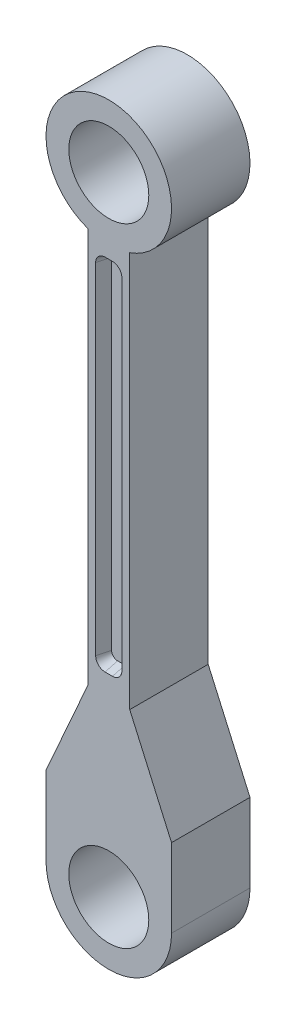
ISO-10303-21;
HEADER;
FILE_DESCRIPTION(('STEP AP214'),'2;1');
FILE_NAME('part.step','',(''),(''),'','','');
FILE_SCHEMA(('AUTOMOTIVE_DESIGN { 1 0 10303 214 1 1 1 1 }'));
ENDSEC;
DATA;
#1=APPLICATION_CONTEXT('core data for automotive mechanical design processes');
#2=APPLICATION_PROTOCOL_DEFINITION('international standard','automotive_design',2000,#1);
#3=PRODUCT_CONTEXT('',#1,'mechanical');
#4=PRODUCT('Part','Part','',(#3));
#5=PRODUCT_RELATED_PRODUCT_CATEGORY('part','',(#4));
#6=PRODUCT_DEFINITION_FORMATION('','',#4);
#7=PRODUCT_DEFINITION_CONTEXT('part definition',#1,'design');
#8=PRODUCT_DEFINITION('design','',#6,#7);
#9=PRODUCT_DEFINITION_SHAPE('','',#8);
#10=(LENGTH_UNIT() NAMED_UNIT(*) SI_UNIT(.MILLI.,.METRE.));
#11=(NAMED_UNIT(*) PLANE_ANGLE_UNIT() SI_UNIT($,.RADIAN.));
#12=(NAMED_UNIT(*) SI_UNIT($,.STERADIAN.) SOLID_ANGLE_UNIT());
#13=UNCERTAINTY_MEASURE_WITH_UNIT(LENGTH_MEASURE(1.E-05),#10,'distance_accuracy_value','');
#14=(GEOMETRIC_REPRESENTATION_CONTEXT(3) GLOBAL_UNCERTAINTY_ASSIGNED_CONTEXT((#13)) GLOBAL_UNIT_ASSIGNED_CONTEXT((#10,
#11,#12)) REPRESENTATION_CONTEXT('',''));
#15=CARTESIAN_POINT('',(0.,0.,0.));
#16=DIRECTION('',(0.,0.,1.));
#17=DIRECTION('',(1.,0.,0.));
#18=AXIS2_PLACEMENT_3D('',#15,#16,#17);
#19=CARTESIAN_POINT('',(0.,11.0248040828004,6.35));
#20=DIRECTION('',(0.,0.,1.));
#21=DIRECTION('',(1.,0.,0.));
#22=AXIS2_PLACEMENT_3D('',#19,#20,#21);
#23=PLANE('',#22);
#24=CARTESIAN_POINT('',(0.,-90.5751959171996,6.35));
#25=DIRECTION('',(0.,0.,1.));
#26=DIRECTION('',(1.,0.,0.));
#27=AXIS2_PLACEMENT_3D('',#24,#25,#26);
#28=CIRCLE('',#27,6.477);
#29=CARTESIAN_POINT('',(6.477,-90.5751959171996,6.35));
#30=VERTEX_POINT('',#29);
#31=EDGE_CURVE('E293',#30,#30,#28,.T.);
#32=ORIENTED_EDGE('',*,*,#31,.F.);
#33=EDGE_LOOP('',(#32));
#34=FACE_BOUND('',#33,.T.);
#35=CARTESIAN_POINT('',(0.,11.0248040828004,6.35));
#36=DIRECTION('',(0.,0.,1.));
#37=DIRECTION('',(1.,0.,0.));
#38=AXIS2_PLACEMENT_3D('',#35,#36,#37);
#39=CIRCLE('',#38,10.16);
#40=CARTESIAN_POINT('',(3.3941513713333,1.44851375363451,6.35));
#41=VERTEX_POINT('',#40);
#42=CARTESIAN_POINT('',(-3.3941513713333,1.44851375363451,6.35));
#43=VERTEX_POINT('',#42);
#44=EDGE_CURVE('E331',#41,#43,#39,.T.);
#45=ORIENTED_EDGE('',*,*,#44,.T.);
#46=DIRECTION('',(0.,-1.,0.));
#47=VECTOR('',#46,1.);
#48=CARTESIAN_POINT('',(-3.3941513713333,-62.607190678735,6.35));
#49=LINE('',#48,#47);
#50=CARTESIAN_POINT('',(-3.3941513713333,-62.607190678735,6.35));
#51=VERTEX_POINT('',#50);
#52=EDGE_CURVE('E334',#43,#51,#49,.T.);
#53=ORIENTED_EDGE('',*,*,#52,.T.);
#54=DIRECTION('',(-0.405141586779867,-0.914253955234262,0.));
#55=VECTOR('',#54,1.);
#56=CARTESIAN_POINT('',(-10.16,-77.8751959171996,6.35));
#57=LINE('',#56,#55);
#58=CARTESIAN_POINT('',(-10.16,-77.8751959171996,6.35));
#59=VERTEX_POINT('',#58);
#60=EDGE_CURVE('E337',#51,#59,#57,.T.);
#61=ORIENTED_EDGE('',*,*,#60,.T.);
#62=DIRECTION('',(0.,-1.,0.));
#63=VECTOR('',#62,1.);
#64=CARTESIAN_POINT('',(-10.16,-90.5751959171996,6.35));
#65=LINE('',#64,#63);
#66=CARTESIAN_POINT('',(-10.16,-90.5751959171996,6.35));
#67=VERTEX_POINT('',#66);
#68=EDGE_CURVE('E340',#59,#67,#65,.T.);
#69=ORIENTED_EDGE('',*,*,#68,.T.);
#70=CARTESIAN_POINT('',(0.,-90.5751959171996,6.35));
#71=DIRECTION('',(0.,0.,1.));
#72=DIRECTION('',(1.,0.,0.));
#73=AXIS2_PLACEMENT_3D('',#70,#71,#72);
#74=CIRCLE('',#73,10.16);
#75=CARTESIAN_POINT('',(10.16,-90.5751959171996,6.35));
#76=VERTEX_POINT('',#75);
#77=EDGE_CURVE('E343',#67,#76,#74,.T.);
#78=ORIENTED_EDGE('',*,*,#77,.T.);
#79=DIRECTION('',(0.,1.,0.));
#80=VECTOR('',#79,1.);
#81=CARTESIAN_POINT('',(10.16,-90.5751959171996,6.35));
#82=LINE('',#81,#80);
#83=CARTESIAN_POINT('',(10.16,-77.8751959171996,6.35));
#84=VERTEX_POINT('',#83);
#85=EDGE_CURVE('E346',#76,#84,#82,.T.);
#86=ORIENTED_EDGE('',*,*,#85,.T.);
#87=DIRECTION('',(-0.405141586779867,0.914253955234262,0.));
#88=VECTOR('',#87,1.);
#89=CARTESIAN_POINT('',(10.16,-77.8751959171996,6.35));
#90=LINE('',#89,#88);
#91=CARTESIAN_POINT('',(3.3941513713333,-62.607190678735,6.35));
#92=VERTEX_POINT('',#91);
#93=EDGE_CURVE('E349',#84,#92,#90,.T.);
#94=ORIENTED_EDGE('',*,*,#93,.T.);
#95=DIRECTION('',(0.,1.,0.));
#96=VECTOR('',#95,1.);
#97=CARTESIAN_POINT('',(3.3941513713333,-62.607190678735,6.35));
#98=LINE('',#97,#96);
#99=EDGE_CURVE('E352',#92,#41,#98,.T.);
#100=ORIENTED_EDGE('',*,*,#99,.T.);
#101=EDGE_LOOP('',(#45,#53,#61,#69,#78,#86,#94,#100));
#102=FACE_BOUND('',#101,.T.);
#103=CARTESIAN_POINT('',(0.,11.0248040828004,6.35));
#104=DIRECTION('',(0.,0.,1.));
#105=DIRECTION('',(1.,0.,0.));
#106=AXIS2_PLACEMENT_3D('',#103,#104,#105);
#107=CIRCLE('',#106,6.477);
#108=CARTESIAN_POINT('',(6.477,11.0248040828004,6.35));
#109=VERTEX_POINT('',#108);
#110=EDGE_CURVE('E328',#109,#109,#107,.T.);
#111=ORIENTED_EDGE('',*,*,#110,.F.);
#112=EDGE_LOOP('',(#111));
#113=FACE_BOUND('',#112,.T.);
#114=DIRECTION('',(0.,-1.,0.));
#115=VECTOR('',#114,1.);
#116=CARTESIAN_POINT('',(-2.12415532227763,0.,6.35));
#117=LINE('',#116,#115);
#118=CARTESIAN_POINT('',(-2.12415532227763,-2.6911959171996,6.35));
#119=VERTEX_POINT('',#118);
#120=CARTESIAN_POINT('',(-2.12415532227764,-57.8091959171996,6.35));
#121=VERTEX_POINT('',#120);
#122=EDGE_CURVE('E269',#119,#121,#117,.T.);
#123=ORIENTED_EDGE('',*,*,#122,.F.);
#124=CARTESIAN_POINT('',(-0.600155322277631,-2.69119591719959,6.35));
#125=DIRECTION('',(0.,0.,1.));
#126=DIRECTION('',(1.,0.,0.));
#127=AXIS2_PLACEMENT_3D('',#124,#125,#126);
#128=CIRCLE('',#127,1.524);
#129=CARTESIAN_POINT('',(-0.600155322277621,-1.16719591719959,6.35));
#130=VERTEX_POINT('',#129);
#131=EDGE_CURVE('E59',#119,#130,#128,.F.);
#132=ORIENTED_EDGE('',*,*,#131,.T.);
#133=DIRECTION('',(-1.,0.,0.));
#134=VECTOR('',#133,1.);
#135=CARTESIAN_POINT('',(0.,-1.16719591719959,6.35));
#136=LINE('',#135,#134);
#137=CARTESIAN_POINT('',(0.60015532227762,-1.16719591719959,6.35));
#138=VERTEX_POINT('',#137);
#139=EDGE_CURVE('E287',#138,#130,#136,.T.);
#140=ORIENTED_EDGE('',*,*,#139,.F.);
#141=CARTESIAN_POINT('',(0.600155322277631,-2.69119591719959,6.35));
#142=DIRECTION('',(0.,0.,1.));
#143=DIRECTION('',(1.,0.,0.));
#144=AXIS2_PLACEMENT_3D('',#141,#142,#143);
#145=CIRCLE('',#144,1.524);
#146=CARTESIAN_POINT('',(2.12415532227763,-2.6911959171996,6.35));
#147=VERTEX_POINT('',#146);
#148=EDGE_CURVE('E284',#147,#138,#145,.T.);
#149=ORIENTED_EDGE('',*,*,#148,.F.);
#150=DIRECTION('',(0.,-1.,0.));
#151=VECTOR('',#150,1.);
#152=CARTESIAN_POINT('',(2.12415532227763,0.,6.35));
#153=LINE('',#152,#151);
#154=CARTESIAN_POINT('',(2.12415532227764,-57.8091959171996,6.35));
#155=VERTEX_POINT('',#154);
#156=EDGE_CURVE('E281',#147,#155,#153,.T.);
#157=ORIENTED_EDGE('',*,*,#156,.T.);
#158=CARTESIAN_POINT('',(0.600155322277639,-57.8091959171996,6.35));
#159=DIRECTION('',(0.,0.,1.));
#160=DIRECTION('',(1.,0.,0.));
#161=AXIS2_PLACEMENT_3D('',#158,#159,#160);
#162=CIRCLE('',#161,1.524);
#163=CARTESIAN_POINT('',(0.600155322277628,-59.3331959171996,6.35));
#164=VERTEX_POINT('',#163);
#165=EDGE_CURVE('E278',#155,#164,#162,.F.);
#166=ORIENTED_EDGE('',*,*,#165,.T.);
#167=DIRECTION('',(-1.,0.,0.));
#168=VECTOR('',#167,1.);
#169=CARTESIAN_POINT('',(0.,-59.3331959171996,6.35));
#170=LINE('',#169,#168);
#171=CARTESIAN_POINT('',(-0.600155322277628,-59.3331959171996,6.35));
#172=VERTEX_POINT('',#171);
#173=EDGE_CURVE('E275',#164,#172,#170,.T.);
#174=ORIENTED_EDGE('',*,*,#173,.T.);
#175=CARTESIAN_POINT('',(-0.600155322277638,-57.8091959171996,6.35));
#176=DIRECTION('',(0.,0.,1.));
#177=DIRECTION('',(1.,0.,0.));
#178=AXIS2_PLACEMENT_3D('',#175,#176,#177);
#179=CIRCLE('',#178,1.524);
#180=EDGE_CURVE('E272',#172,#121,#179,.F.);
#181=ORIENTED_EDGE('',*,*,#180,.T.);
#182=EDGE_LOOP('',(#123,#132,#140,#149,#157,#166,#174,#181));
#183=FACE_BOUND('',#182,.T.);
#184=ADVANCED_FACE('F34',(#34,#102,#113,#183),#23,.T.);
#185=CARTESIAN_POINT('',(0.,11.0248040828004,-6.35));
#186=DIRECTION('',(0.,0.,1.));
#187=DIRECTION('',(1.,0.,0.));
#188=AXIS2_PLACEMENT_3D('',#185,#186,#187);
#189=CYLINDRICAL_SURFACE('',#188,10.16);
#190=DIRECTION('',(0.,0.,1.));
#191=VECTOR('',#190,1.);
#192=CARTESIAN_POINT('',(-3.3941513713333,1.44851375363451,-6.35));
#193=LINE('',#192,#191);
#194=CARTESIAN_POINT('',(-3.3941513713333,1.44851375363451,-6.35));
#195=VERTEX_POINT('',#194);
#196=EDGE_CURVE('E38',#195,#43,#193,.T.);
#197=ORIENTED_EDGE('',*,*,#196,.T.);
#198=ORIENTED_EDGE('',*,*,#44,.F.);
#199=DIRECTION('',(0.,0.,1.));
#200=VECTOR('',#199,1.);
#201=CARTESIAN_POINT('',(3.3941513713333,1.44851375363451,-6.35));
#202=LINE('',#201,#200);
#203=CARTESIAN_POINT('',(3.3941513713333,1.44851375363451,-6.35));
#204=VERTEX_POINT('',#203);
#205=EDGE_CURVE('E11',#204,#41,#202,.T.);
#206=ORIENTED_EDGE('',*,*,#205,.F.);
#207=CARTESIAN_POINT('',(0.,11.0248040828004,-6.35));
#208=DIRECTION('',(0.,0.,1.));
#209=DIRECTION('',(1.,0.,0.));
#210=AXIS2_PLACEMENT_3D('',#207,#208,#209);
#211=CIRCLE('',#210,10.16);
#212=EDGE_CURVE('E361',#204,#195,#211,.T.);
#213=ORIENTED_EDGE('',*,*,#212,.T.);
#214=EDGE_LOOP('',(#197,#198,#206,#213));
#215=FACE_BOUND('',#214,.T.);
#216=ADVANCED_FACE('F36',(#215),#189,.T.);
#217=CARTESIAN_POINT('',(3.3941513713333,-62.607190678735,-6.35));
#218=DIRECTION('',(1.,0.,0.));
#219=DIRECTION('',(0.,1.,0.));
#220=AXIS2_PLACEMENT_3D('',#217,#218,#219);
#221=PLANE('',#220);
#222=ORIENTED_EDGE('',*,*,#205,.T.);
#223=ORIENTED_EDGE('',*,*,#99,.F.);
#224=DIRECTION('',(0.,0.,1.));
#225=VECTOR('',#224,1.);
#226=CARTESIAN_POINT('',(3.3941513713333,-62.607190678735,-6.35));
#227=LINE('',#226,#225);
#228=CARTESIAN_POINT('',(3.3941513713333,-62.607190678735,-6.35));
#229=VERTEX_POINT('',#228);
#230=EDGE_CURVE('E43',#229,#92,#227,.T.);
#231=ORIENTED_EDGE('',*,*,#230,.F.);
#232=DIRECTION('',(0.,1.,0.));
#233=VECTOR('',#232,1.);
#234=CARTESIAN_POINT('',(3.3941513713333,-62.607190678735,-6.35));
#235=LINE('',#234,#233);
#236=EDGE_CURVE('E382',#229,#204,#235,.T.);
#237=ORIENTED_EDGE('',*,*,#236,.T.);
#238=EDGE_LOOP('',(#222,#223,#231,#237));
#239=FACE_BOUND('',#238,.T.);
#240=ADVANCED_FACE('F407',(#239),#221,.T.);
#241=CARTESIAN_POINT('',(10.16,-77.8751959171996,-6.35));
#242=DIRECTION('',(0.914253955234262,0.405141586779867,0.));
#243=DIRECTION('',(-0.405141586779867,0.914253955234262,0.));
#244=AXIS2_PLACEMENT_3D('',#241,#242,#243);
#245=PLANE('',#244);
#246=ORIENTED_EDGE('',*,*,#230,.T.);
#247=ORIENTED_EDGE('',*,*,#93,.F.);
#248=DIRECTION('',(0.,0.,1.));
#249=VECTOR('',#248,1.);
#250=CARTESIAN_POINT('',(10.16,-77.8751959171996,-6.35));
#251=LINE('',#250,#249);
#252=CARTESIAN_POINT('',(10.16,-77.8751959171996,-6.35));
#253=VERTEX_POINT('',#252);
#254=EDGE_CURVE('E386',#253,#84,#251,.T.);
#255=ORIENTED_EDGE('',*,*,#254,.F.);
#256=DIRECTION('',(-0.405141586779867,0.914253955234262,0.));
#257=VECTOR('',#256,1.);
#258=CARTESIAN_POINT('',(10.16,-77.8751959171996,-6.35));
#259=LINE('',#258,#257);
#260=EDGE_CURVE('E379',#253,#229,#259,.T.);
#261=ORIENTED_EDGE('',*,*,#260,.T.);
#262=EDGE_LOOP('',(#246,#247,#255,#261));
#263=FACE_BOUND('',#262,.T.);
#264=ADVANCED_FACE('F427',(#263),#245,.T.);
#265=CARTESIAN_POINT('',(10.16,-90.5751959171996,-6.35));
#266=DIRECTION('',(1.,0.,0.));
#267=DIRECTION('',(0.,1.,0.));
#268=AXIS2_PLACEMENT_3D('',#265,#266,#267);
#269=PLANE('',#268);
#270=ORIENTED_EDGE('',*,*,#254,.T.);
#271=ORIENTED_EDGE('',*,*,#85,.F.);
#272=DIRECTION('',(0.,0.,1.));
#273=VECTOR('',#272,1.);
#274=CARTESIAN_POINT('',(10.16,-90.5751959171996,-6.35));
#275=LINE('',#274,#273);
#276=CARTESIAN_POINT('',(10.16,-90.5751959171996,-6.35));
#277=VERTEX_POINT('',#276);
#278=EDGE_CURVE('E388',#277,#76,#275,.T.);
#279=ORIENTED_EDGE('',*,*,#278,.F.);
#280=DIRECTION('',(0.,1.,0.));
#281=VECTOR('',#280,1.);
#282=CARTESIAN_POINT('',(10.16,-90.5751959171996,-6.35));
#283=LINE('',#282,#281);
#284=EDGE_CURVE('E376',#277,#253,#283,.T.);
#285=ORIENTED_EDGE('',*,*,#284,.T.);
#286=EDGE_LOOP('',(#270,#271,#279,#285));
#287=FACE_BOUND('',#286,.T.);
#288=ADVANCED_FACE('F424',(#287),#269,.T.);
#289=CARTESIAN_POINT('',(0.,-90.5751959171996,-6.35));
#290=DIRECTION('',(0.,0.,1.));
#291=DIRECTION('',(1.,0.,0.));
#292=AXIS2_PLACEMENT_3D('',#289,#290,#291);
#293=CYLINDRICAL_SURFACE('',#292,10.16);
#294=ORIENTED_EDGE('',*,*,#278,.T.);
#295=ORIENTED_EDGE('',*,*,#77,.F.);
#296=DIRECTION('',(0.,0.,1.));
#297=VECTOR('',#296,1.);
#298=CARTESIAN_POINT('',(-10.16,-90.5751959171996,-6.35));
#299=LINE('',#298,#297);
#300=CARTESIAN_POINT('',(-10.16,-90.5751959171996,-6.35));
#301=VERTEX_POINT('',#300);
#302=EDGE_CURVE('E390',#301,#67,#299,.T.);
#303=ORIENTED_EDGE('',*,*,#302,.F.);
#304=CARTESIAN_POINT('',(0.,-90.5751959171996,-6.35));
#305=DIRECTION('',(0.,0.,1.));
#306=DIRECTION('',(1.,0.,0.));
#307=AXIS2_PLACEMENT_3D('',#304,#305,#306);
#308=CIRCLE('',#307,10.16);
#309=EDGE_CURVE('E373',#301,#277,#308,.T.);
#310=ORIENTED_EDGE('',*,*,#309,.T.);
#311=EDGE_LOOP('',(#294,#295,#303,#310));
#312=FACE_BOUND('',#311,.T.);
#313=ADVANCED_FACE('F421',(#312),#293,.T.);
#314=CARTESIAN_POINT('',(-10.16,-90.5751959171996,-6.35));
#315=DIRECTION('',(-1.,0.,0.));
#316=DIRECTION('',(0.,0.,1.));
#317=AXIS2_PLACEMENT_3D('',#314,#315,#316);
#318=PLANE('',#317);
#319=ORIENTED_EDGE('',*,*,#302,.T.);
#320=ORIENTED_EDGE('',*,*,#68,.F.);
#321=DIRECTION('',(0.,0.,1.));
#322=VECTOR('',#321,1.);
#323=CARTESIAN_POINT('',(-10.16,-77.8751959171996,-6.35));
#324=LINE('',#323,#322);
#325=CARTESIAN_POINT('',(-10.16,-77.8751959171996,-6.35));
#326=VERTEX_POINT('',#325);
#327=EDGE_CURVE('E392',#326,#59,#324,.T.);
#328=ORIENTED_EDGE('',*,*,#327,.F.);
#329=DIRECTION('',(0.,-1.,0.));
#330=VECTOR('',#329,1.);
#331=CARTESIAN_POINT('',(-10.16,-90.5751959171996,-6.35));
#332=LINE('',#331,#330);
#333=EDGE_CURVE('E370',#326,#301,#332,.T.);
#334=ORIENTED_EDGE('',*,*,#333,.T.);
#335=EDGE_LOOP('',(#319,#320,#328,#334));
#336=FACE_BOUND('',#335,.T.);
#337=ADVANCED_FACE('F419',(#336),#318,.T.);
#338=CARTESIAN_POINT('',(-10.16,-77.8751959171996,-6.35));
#339=DIRECTION('',(-0.914253955234262,0.405141586779867,0.));
#340=DIRECTION('',(-0.405141586779867,-0.914253955234262,0.));
#341=AXIS2_PLACEMENT_3D('',#338,#339,#340);
#342=PLANE('',#341);
#343=ORIENTED_EDGE('',*,*,#327,.T.);
#344=ORIENTED_EDGE('',*,*,#60,.F.);
#345=DIRECTION('',(0.,0.,1.));
#346=VECTOR('',#345,1.);
#347=CARTESIAN_POINT('',(-3.3941513713333,-62.607190678735,-6.35));
#348=LINE('',#347,#346);
#349=CARTESIAN_POINT('',(-3.3941513713333,-62.607190678735,-6.35));
#350=VERTEX_POINT('',#349);
#351=EDGE_CURVE('E393',#350,#51,#348,.T.);
#352=ORIENTED_EDGE('',*,*,#351,.F.);
#353=DIRECTION('',(-0.405141586779867,-0.914253955234262,0.));
#354=VECTOR('',#353,1.);
#355=CARTESIAN_POINT('',(-10.16,-77.8751959171996,-6.35));
#356=LINE('',#355,#354);
#357=EDGE_CURVE('E367',#350,#326,#356,.T.);
#358=ORIENTED_EDGE('',*,*,#357,.T.);
#359=EDGE_LOOP('',(#343,#344,#352,#358));
#360=FACE_BOUND('',#359,.T.);
#361=ADVANCED_FACE('F415',(#360),#342,.T.);
#362=CARTESIAN_POINT('',(-3.3941513713333,-62.607190678735,-6.35));
#363=DIRECTION('',(-1.,0.,0.));
#364=DIRECTION('',(0.,-1.,0.));
#365=AXIS2_PLACEMENT_3D('',#362,#363,#364);
#366=PLANE('',#365);
#367=ORIENTED_EDGE('',*,*,#351,.T.);
#368=ORIENTED_EDGE('',*,*,#52,.F.);
#369=ORIENTED_EDGE('',*,*,#196,.F.);
#370=DIRECTION('',(0.,-1.,0.));
#371=VECTOR('',#370,1.);
#372=CARTESIAN_POINT('',(-3.3941513713333,-62.607190678735,-6.35));
#373=LINE('',#372,#371);
#374=EDGE_CURVE('E364',#195,#350,#373,.T.);
#375=ORIENTED_EDGE('',*,*,#374,.T.);
#376=EDGE_LOOP('',(#367,#368,#369,#375));
#377=FACE_BOUND('',#376,.T.);
#378=ADVANCED_FACE('F400',(#377),#366,.T.);
#379=CARTESIAN_POINT('',(0.,11.0248040828004,-6.35));
#380=DIRECTION('',(0.,0.,1.));
#381=DIRECTION('',(1.,0.,0.));
#382=AXIS2_PLACEMENT_3D('',#379,#380,#381);
#383=PLANE('',#382);
#384=DIRECTION('',(-1.,0.,0.));
#385=VECTOR('',#384,1.);
#386=CARTESIAN_POINT('',(0.,-1.16719591719959,-6.35));
#387=LINE('',#386,#385);
#388=CARTESIAN_POINT('',(0.60015532227762,-1.16719591719959,-6.35));
#389=VERTEX_POINT('',#388);
#390=CARTESIAN_POINT('',(-0.600155322277624,-1.16719591719959,-6.35));
#391=VERTEX_POINT('',#390);
#392=EDGE_CURVE('E211',#389,#391,#387,.T.);
#393=ORIENTED_EDGE('',*,*,#392,.T.);
#394=CARTESIAN_POINT('',(-0.600155322277631,-2.69119591719959,-6.35));
#395=DIRECTION('',(0.,0.,1.));
#396=DIRECTION('',(1.,0.,0.));
#397=AXIS2_PLACEMENT_3D('',#394,#395,#396);
#398=CIRCLE('',#397,1.524);
#399=CARTESIAN_POINT('',(-2.12415532227763,-2.6911959171996,-6.35));
#400=VERTEX_POINT('',#399);
#401=EDGE_CURVE('E51',#400,#391,#398,.F.);
#402=ORIENTED_EDGE('',*,*,#401,.F.);
#403=DIRECTION('',(0.,-1.,0.));
#404=VECTOR('',#403,1.);
#405=CARTESIAN_POINT('',(-2.12415532227763,0.,-6.35));
#406=LINE('',#405,#404);
#407=CARTESIAN_POINT('',(-2.12415532227764,-57.8091959171996,-6.35));
#408=VERTEX_POINT('',#407);
#409=EDGE_CURVE('E233',#400,#408,#406,.T.);
#410=ORIENTED_EDGE('',*,*,#409,.T.);
#411=CARTESIAN_POINT('',(-0.600155322277638,-57.8091959171996,-6.35));
#412=DIRECTION('',(0.,0.,1.));
#413=DIRECTION('',(1.,0.,0.));
#414=AXIS2_PLACEMENT_3D('',#411,#412,#413);
#415=CIRCLE('',#414,1.524);
#416=CARTESIAN_POINT('',(-0.600155322277628,-59.3331959171996,-6.35));
#417=VERTEX_POINT('',#416);
#418=EDGE_CURVE('E230',#417,#408,#415,.F.);
#419=ORIENTED_EDGE('',*,*,#418,.F.);
#420=DIRECTION('',(-1.,0.,0.));
#421=VECTOR('',#420,1.);
#422=CARTESIAN_POINT('',(0.,-59.3331959171996,-6.35));
#423=LINE('',#422,#421);
#424=CARTESIAN_POINT('',(0.600155322277628,-59.3331959171996,-6.35));
#425=VERTEX_POINT('',#424);
#426=EDGE_CURVE('E227',#425,#417,#423,.T.);
#427=ORIENTED_EDGE('',*,*,#426,.F.);
#428=CARTESIAN_POINT('',(0.600155322277639,-57.8091959171996,-6.35));
#429=DIRECTION('',(0.,0.,1.));
#430=DIRECTION('',(1.,0.,0.));
#431=AXIS2_PLACEMENT_3D('',#428,#429,#430);
#432=CIRCLE('',#431,1.524);
#433=CARTESIAN_POINT('',(2.12415532227764,-57.8091959171996,-6.35));
#434=VERTEX_POINT('',#433);
#435=EDGE_CURVE('E221',#434,#425,#432,.F.);
#436=ORIENTED_EDGE('',*,*,#435,.F.);
#437=DIRECTION('',(0.,-1.,0.));
#438=VECTOR('',#437,1.);
#439=CARTESIAN_POINT('',(2.12415532227763,0.,-6.35));
#440=LINE('',#439,#438);
#441=CARTESIAN_POINT('',(2.12415532227763,-2.6911959171996,-6.35));
#442=VERTEX_POINT('',#441);
#443=EDGE_CURVE('E219',#442,#434,#440,.T.);
#444=ORIENTED_EDGE('',*,*,#443,.F.);
#445=CARTESIAN_POINT('',(0.600155322277631,-2.69119591719959,-6.35));
#446=DIRECTION('',(0.,0.,1.));
#447=DIRECTION('',(1.,0.,0.));
#448=AXIS2_PLACEMENT_3D('',#445,#446,#447);
#449=CIRCLE('',#448,1.524);
#450=EDGE_CURVE('E201',#442,#389,#449,.T.);
#451=ORIENTED_EDGE('',*,*,#450,.T.);
#452=EDGE_LOOP('',(#393,#402,#410,#419,#427,#436,#444,#451));
#453=FACE_BOUND('',#452,.T.);
#454=CARTESIAN_POINT('',(0.,-90.5751959171996,-6.35));
#455=DIRECTION('',(0.,0.,1.));
#456=DIRECTION('',(1.,0.,0.));
#457=AXIS2_PLACEMENT_3D('',#454,#455,#456);
#458=CIRCLE('',#457,6.477);
#459=CARTESIAN_POINT('',(6.477,-90.5751959171996,-6.35));
#460=VERTEX_POINT('',#459);
#461=EDGE_CURVE('E355',#460,#460,#458,.T.);
#462=ORIENTED_EDGE('',*,*,#461,.T.);
#463=EDGE_LOOP('',(#462));
#464=FACE_BOUND('',#463,.T.);
#465=CARTESIAN_POINT('',(0.,11.0248040828004,-6.35));
#466=DIRECTION('',(0.,0.,1.));
#467=DIRECTION('',(1.,0.,0.));
#468=AXIS2_PLACEMENT_3D('',#465,#466,#467);
#469=CIRCLE('',#468,6.477);
#470=CARTESIAN_POINT('',(6.477,11.0248040828004,-6.35));
#471=VERTEX_POINT('',#470);
#472=EDGE_CURVE('E358',#471,#471,#469,.T.);
#473=ORIENTED_EDGE('',*,*,#472,.T.);
#474=EDGE_LOOP('',(#473));
#475=FACE_BOUND('',#474,.T.);
#476=ORIENTED_EDGE('',*,*,#212,.F.);
#477=ORIENTED_EDGE('',*,*,#236,.F.);
#478=ORIENTED_EDGE('',*,*,#260,.F.);
#479=ORIENTED_EDGE('',*,*,#284,.F.);
#480=ORIENTED_EDGE('',*,*,#309,.F.);
#481=ORIENTED_EDGE('',*,*,#333,.F.);
#482=ORIENTED_EDGE('',*,*,#357,.F.);
#483=ORIENTED_EDGE('',*,*,#374,.F.);
#484=EDGE_LOOP('',(#476,#477,#478,#479,#480,#481,#482,#483));
#485=FACE_BOUND('',#484,.T.);
#486=ADVANCED_FACE('F215',(#453,#464,#475,#485),#383,.F.);
#487=CARTESIAN_POINT('',(0.,11.0248040828004,-6.35));
#488=DIRECTION('',(0.,0.,1.));
#489=DIRECTION('',(1.,0.,0.));
#490=AXIS2_PLACEMENT_3D('',#487,#488,#489);
#491=CYLINDRICAL_SURFACE('',#490,6.477);
#492=ORIENTED_EDGE('',*,*,#472,.F.);
#493=EDGE_LOOP('',(#492));
#494=FACE_BOUND('',#493,.T.);
#495=ORIENTED_EDGE('',*,*,#110,.T.);
#496=EDGE_LOOP('',(#495));
#497=FACE_BOUND('',#496,.T.);
#498=ADVANCED_FACE('F453',(#494,#497),#491,.F.);
#499=CARTESIAN_POINT('',(0.,-90.5751959171996,-6.35));
#500=DIRECTION('',(0.,0.,1.));
#501=DIRECTION('',(1.,0.,0.));
#502=AXIS2_PLACEMENT_3D('',#499,#500,#501);
#503=CYLINDRICAL_SURFACE('',#502,6.477);
#504=ORIENTED_EDGE('',*,*,#461,.F.);
#505=EDGE_LOOP('',(#504));
#506=FACE_BOUND('',#505,.T.);
#507=ORIENTED_EDGE('',*,*,#31,.T.);
#508=EDGE_LOOP('',(#507));
#509=FACE_BOUND('',#508,.T.);
#510=ADVANCED_FACE('F449',(#506,#509),#503,.F.);
#511=CARTESIAN_POINT('',(-0.600155322277631,-2.69119591719959,6.35));
#512=DIRECTION('',(0.,0.,1.));
#513=DIRECTION('',(1.,0.,0.));
#514=AXIS2_PLACEMENT_3D('',#511,#512,#513);
#515=CONICAL_SURFACE('',#514,1.524,0.261799387799149);
#516=ORIENTED_EDGE('',*,*,#131,.F.);
#517=DIRECTION('',(-0.258819045102521,0.,0.965925826289068));
#518=VECTOR('',#517,1.);
#519=CARTESIAN_POINT('',(-2.12415532227763,-2.6911959171996,6.35));
#520=LINE('',#519,#518);
#521=CARTESIAN_POINT('',(-1.57968256325759,-2.6911959171996,4.318));
#522=VERTEX_POINT('',#521);
#523=EDGE_CURVE('E295',#522,#119,#520,.T.);
#524=ORIENTED_EDGE('',*,*,#523,.F.);
#525=CARTESIAN_POINT('',(-0.600155322277631,-2.69119591719959,4.318));
#526=DIRECTION('',(0.,0.,1.));
#527=DIRECTION('',(1.,0.,0.));
#528=AXIS2_PLACEMENT_3D('',#525,#526,#527);
#529=CIRCLE('',#528,0.979527240979959);
#530=CARTESIAN_POINT('',(-0.600155322277621,-1.71166867621964,4.318));
#531=VERTEX_POINT('',#530);
#532=EDGE_CURVE('E290',#522,#531,#529,.F.);
#533=ORIENTED_EDGE('',*,*,#532,.T.);
#534=DIRECTION('',(0.,0.258819045102521,0.965925826289068));
#535=VECTOR('',#534,1.);
#536=CARTESIAN_POINT('',(-0.600155322277621,-1.16719591719959,6.35));
#537=LINE('',#536,#535);
#538=EDGE_CURVE('E291',#531,#130,#537,.T.);
#539=ORIENTED_EDGE('',*,*,#538,.T.);
#540=EDGE_LOOP('',(#516,#524,#533,#539));
#541=FACE_BOUND('',#540,.T.);
#542=ADVANCED_FACE('F452',(#541),#515,.F.);
#543=CARTESIAN_POINT('',(0.,-1.16719591719959,6.35));
#544=DIRECTION('',(0.,0.965925826289068,-0.258819045102521));
#545=DIRECTION('',(0.,0.258819045102521,0.965925826289068));
#546=AXIS2_PLACEMENT_3D('',#543,#544,#545);
#547=PLANE('',#546);
#548=ORIENTED_EDGE('',*,*,#139,.T.);
#549=ORIENTED_EDGE('',*,*,#538,.F.);
#550=DIRECTION('',(-1.,0.,0.));
#551=VECTOR('',#550,1.);
#552=CARTESIAN_POINT('',(0.,-1.71166867621964,4.318));
#553=LINE('',#552,#551);
#554=CARTESIAN_POINT('',(0.600155322277624,-1.71166867621964,4.318));
#555=VERTEX_POINT('',#554);
#556=EDGE_CURVE('E298',#555,#531,#553,.T.);
#557=ORIENTED_EDGE('',*,*,#556,.F.);
#558=DIRECTION('',(0.,0.258819045102521,0.965925826289068));
#559=VECTOR('',#558,1.);
#560=CARTESIAN_POINT('',(0.60015532227762,-1.16719591719959,6.35));
#561=LINE('',#560,#559);
#562=EDGE_CURVE('E294',#555,#138,#561,.T.);
#563=ORIENTED_EDGE('',*,*,#562,.T.);
#564=EDGE_LOOP('',(#548,#549,#557,#563));
#565=FACE_BOUND('',#564,.T.);
#566=ADVANCED_FACE('F447',(#565),#547,.F.);
#567=CARTESIAN_POINT('',(0.600155322277631,-2.69119591719959,6.35));
#568=DIRECTION('',(0.,0.,1.));
#569=DIRECTION('',(1.,0.,0.));
#570=AXIS2_PLACEMENT_3D('',#567,#568,#569);
#571=CONICAL_SURFACE('',#570,1.524,0.261799387799149);
#572=ORIENTED_EDGE('',*,*,#148,.T.);
#573=ORIENTED_EDGE('',*,*,#562,.F.);
#574=CARTESIAN_POINT('',(0.600155322277631,-2.69119591719959,4.318));
#575=DIRECTION('',(0.,0.,1.));
#576=DIRECTION('',(1.,0.,0.));
#577=AXIS2_PLACEMENT_3D('',#574,#575,#576);
#578=CIRCLE('',#577,0.979527240979959);
#579=CARTESIAN_POINT('',(1.57968256325759,-2.6911959171996,4.318));
#580=VERTEX_POINT('',#579);
#581=EDGE_CURVE('E313',#580,#555,#578,.T.);
#582=ORIENTED_EDGE('',*,*,#581,.F.);
#583=DIRECTION('',(0.258819045102521,0.,0.965925826289068));
#584=VECTOR('',#583,1.);
#585=CARTESIAN_POINT('',(2.12415532227763,-2.6911959171996,6.35));
#586=LINE('',#585,#584);
#587=EDGE_CURVE('E306',#580,#147,#586,.T.);
#588=ORIENTED_EDGE('',*,*,#587,.T.);
#589=EDGE_LOOP('',(#572,#573,#582,#588));
#590=FACE_BOUND('',#589,.T.);
#591=ADVANCED_FACE('F517',(#590),#571,.F.);
#592=CARTESIAN_POINT('',(2.12415532227763,0.,6.35));
#593=DIRECTION('',(0.965925826289068,0.,-0.258819045102521));
#594=DIRECTION('',(-0.258819045102521,0.,-0.965925826289068));
#595=AXIS2_PLACEMENT_3D('',#592,#593,#594);
#596=PLANE('',#595);
#597=ORIENTED_EDGE('',*,*,#156,.F.);
#598=ORIENTED_EDGE('',*,*,#587,.F.);
#599=DIRECTION('',(0.,1.,0.));
#600=VECTOR('',#599,1.);
#601=CARTESIAN_POINT('',(1.57968256325759,0.,4.318));
#602=LINE('',#601,#600);
#603=CARTESIAN_POINT('',(1.5796825632576,-57.8091959171996,4.318));
#604=VERTEX_POINT('',#603);
#605=EDGE_CURVE('E316',#580,#604,#602,.F.);
#606=ORIENTED_EDGE('',*,*,#605,.T.);
#607=DIRECTION('',(0.258819045102521,0.,0.965925826289068));
#608=VECTOR('',#607,1.);
#609=CARTESIAN_POINT('',(2.12415532227764,-57.8091959171996,6.35));
#610=LINE('',#609,#608);
#611=EDGE_CURVE('E304',#604,#155,#610,.T.);
#612=ORIENTED_EDGE('',*,*,#611,.T.);
#613=EDGE_LOOP('',(#597,#598,#606,#612));
#614=FACE_BOUND('',#613,.T.);
#615=ADVANCED_FACE('F524',(#614),#596,.F.);
#616=CARTESIAN_POINT('',(0.600155322277639,-57.8091959171996,6.35));
#617=DIRECTION('',(0.,0.,1.));
#618=DIRECTION('',(1.,0.,0.));
#619=AXIS2_PLACEMENT_3D('',#616,#617,#618);
#620=CONICAL_SURFACE('',#619,1.524,0.261799387799149);
#621=ORIENTED_EDGE('',*,*,#165,.F.);
#622=ORIENTED_EDGE('',*,*,#611,.F.);
#623=CARTESIAN_POINT('',(0.600155322277639,-57.8091959171996,4.318));
#624=DIRECTION('',(0.,0.,1.));
#625=DIRECTION('',(1.,0.,0.));
#626=AXIS2_PLACEMENT_3D('',#623,#624,#625);
#627=CIRCLE('',#626,0.979527240979958);
#628=CARTESIAN_POINT('',(0.600155322277628,-58.7887231581796,4.318));
#629=VERTEX_POINT('',#628);
#630=EDGE_CURVE('E318',#604,#629,#627,.F.);
#631=ORIENTED_EDGE('',*,*,#630,.T.);
#632=DIRECTION('',(0.,-0.258819045102521,0.965925826289068));
#633=VECTOR('',#632,1.);
#634=CARTESIAN_POINT('',(0.600155322277628,-59.3331959171996,6.35));
#635=LINE('',#634,#633);
#636=EDGE_CURVE('E302',#629,#164,#635,.T.);
#637=ORIENTED_EDGE('',*,*,#636,.T.);
#638=EDGE_LOOP('',(#621,#622,#631,#637));
#639=FACE_BOUND('',#638,.T.);
#640=ADVANCED_FACE('F531',(#639),#620,.F.);
#641=CARTESIAN_POINT('',(0.,-59.3331959171996,6.35));
#642=DIRECTION('',(0.,-0.965925826289068,-0.258819045102521));
#643=DIRECTION('',(0.,0.258819045102521,-0.965925826289068));
#644=AXIS2_PLACEMENT_3D('',#641,#642,#643);
#645=PLANE('',#644);
#646=ORIENTED_EDGE('',*,*,#173,.F.);
#647=ORIENTED_EDGE('',*,*,#636,.F.);
#648=DIRECTION('',(1.,0.,0.));
#649=VECTOR('',#648,1.);
#650=CARTESIAN_POINT('',(0.,-58.7887231581796,4.318));
#651=LINE('',#650,#649);
#652=CARTESIAN_POINT('',(-0.600155322277632,-58.7887231581796,4.318));
#653=VERTEX_POINT('',#652);
#654=EDGE_CURVE('E320',#629,#653,#651,.F.);
#655=ORIENTED_EDGE('',*,*,#654,.T.);
#656=DIRECTION('',(0.,-0.258819045102521,0.965925826289068));
#657=VECTOR('',#656,1.);
#658=CARTESIAN_POINT('',(-0.600155322277628,-59.3331959171996,6.35));
#659=LINE('',#658,#657);
#660=EDGE_CURVE('E300',#653,#172,#659,.T.);
#661=ORIENTED_EDGE('',*,*,#660,.T.);
#662=EDGE_LOOP('',(#646,#647,#655,#661));
#663=FACE_BOUND('',#662,.T.);
#664=ADVANCED_FACE('F539',(#663),#645,.F.);
#665=CARTESIAN_POINT('',(-0.600155322277638,-57.8091959171996,6.35));
#666=DIRECTION('',(0.,0.,1.));
#667=DIRECTION('',(1.,0.,0.));
#668=AXIS2_PLACEMENT_3D('',#665,#666,#667);
#669=CONICAL_SURFACE('',#668,1.524,0.261799387799149);
#670=ORIENTED_EDGE('',*,*,#180,.F.);
#671=ORIENTED_EDGE('',*,*,#660,.F.);
#672=CARTESIAN_POINT('',(-0.600155322277638,-57.8091959171996,4.318));
#673=DIRECTION('',(0.,0.,1.));
#674=DIRECTION('',(1.,0.,0.));
#675=AXIS2_PLACEMENT_3D('',#672,#673,#674);
#676=CIRCLE('',#675,0.979527240979958);
#677=CARTESIAN_POINT('',(-1.5796825632576,-57.8091959171996,4.318));
#678=VERTEX_POINT('',#677);
#679=EDGE_CURVE('E322',#653,#678,#676,.F.);
#680=ORIENTED_EDGE('',*,*,#679,.T.);
#681=DIRECTION('',(-0.258819045102521,0.,0.965925826289068));
#682=VECTOR('',#681,1.);
#683=CARTESIAN_POINT('',(-2.12415532227764,-57.8091959171996,6.35));
#684=LINE('',#683,#682);
#685=EDGE_CURVE('E297',#678,#121,#684,.T.);
#686=ORIENTED_EDGE('',*,*,#685,.T.);
#687=EDGE_LOOP('',(#670,#671,#680,#686));
#688=FACE_BOUND('',#687,.T.);
#689=ADVANCED_FACE('F547',(#688),#669,.F.);
#690=CARTESIAN_POINT('',(-2.12415532227763,0.,6.35));
#691=DIRECTION('',(-0.965925826289068,0.,-0.258819045102521));
#692=DIRECTION('',(-0.258819045102521,0.,0.965925826289068));
#693=AXIS2_PLACEMENT_3D('',#690,#691,#692);
#694=PLANE('',#693);
#695=ORIENTED_EDGE('',*,*,#122,.T.);
#696=ORIENTED_EDGE('',*,*,#685,.F.);
#697=DIRECTION('',(0.,-1.,0.));
#698=VECTOR('',#697,1.);
#699=CARTESIAN_POINT('',(-1.57968256325759,0.,4.318));
#700=LINE('',#699,#698);
#701=EDGE_CURVE('E310',#522,#678,#700,.T.);
#702=ORIENTED_EDGE('',*,*,#701,.F.);
#703=ORIENTED_EDGE('',*,*,#523,.T.);
#704=EDGE_LOOP('',(#695,#696,#702,#703));
#705=FACE_BOUND('',#704,.T.);
#706=ADVANCED_FACE('F555',(#705),#694,.F.);
#707=CARTESIAN_POINT('',(0.,0.,4.318));
#708=DIRECTION('',(0.,0.,1.));
#709=DIRECTION('',(1.,0.,0.));
#710=AXIS2_PLACEMENT_3D('',#707,#708,#709);
#711=PLANE('',#710);
#712=ORIENTED_EDGE('',*,*,#532,.F.);
#713=ORIENTED_EDGE('',*,*,#701,.T.);
#714=ORIENTED_EDGE('',*,*,#679,.F.);
#715=ORIENTED_EDGE('',*,*,#654,.F.);
#716=ORIENTED_EDGE('',*,*,#630,.F.);
#717=ORIENTED_EDGE('',*,*,#605,.F.);
#718=ORIENTED_EDGE('',*,*,#581,.T.);
#719=ORIENTED_EDGE('',*,*,#556,.T.);
#720=EDGE_LOOP('',(#712,#713,#714,#715,#716,#717,#718,#719));
#721=FACE_BOUND('',#720,.T.);
#722=ADVANCED_FACE('F563',(#721),#711,.T.);
#723=CARTESIAN_POINT('',(-0.600155322277631,-2.69119591719959,-6.35));
#724=DIRECTION('',(0.,0.,-1.));
#725=DIRECTION('',(1.,0.,0.));
#726=AXIS2_PLACEMENT_3D('',#723,#724,#725);
#727=CONICAL_SURFACE('',#726,1.524,0.261799387799149);
#728=ORIENTED_EDGE('',*,*,#401,.T.);
#729=DIRECTION('',(0.,0.258819045102521,-0.965925826289068));
#730=VECTOR('',#729,1.);
#731=CARTESIAN_POINT('',(-0.60015532227762,-1.16719591719959,-6.35));
#732=LINE('',#731,#730);
#733=CARTESIAN_POINT('',(-0.600155322277624,-1.71166867621964,-4.318));
#734=VERTEX_POINT('',#733);
#735=EDGE_CURVE('E208',#734,#391,#732,.T.);
#736=ORIENTED_EDGE('',*,*,#735,.F.);
#737=CARTESIAN_POINT('',(-0.600155322277631,-2.69119591719959,-4.318));
#738=DIRECTION('',(0.,0.,-1.));
#739=DIRECTION('',(-1.,0.,0.));
#740=AXIS2_PLACEMENT_3D('',#737,#738,#739);
#741=CIRCLE('',#740,0.979527240979959);
#742=CARTESIAN_POINT('',(-1.57968256325759,-2.6911959171996,-4.318));
#743=VERTEX_POINT('',#742);
#744=EDGE_CURVE('E236',#743,#734,#741,.T.);
#745=ORIENTED_EDGE('',*,*,#744,.F.);
#746=DIRECTION('',(-0.258819045102521,0.,-0.965925826289068));
#747=VECTOR('',#746,1.);
#748=CARTESIAN_POINT('',(-2.12415532227763,-2.6911959171996,-6.35));
#749=LINE('',#748,#747);
#750=EDGE_CURVE('E237',#743,#400,#749,.T.);
#751=ORIENTED_EDGE('',*,*,#750,.T.);
#752=EDGE_LOOP('',(#728,#736,#745,#751));
#753=FACE_BOUND('',#752,.T.);
#754=ADVANCED_FACE('F570',(#753),#727,.F.);
#755=CARTESIAN_POINT('',(-2.12415532227763,0.,-6.35));
#756=DIRECTION('',(-0.965925826289068,0.,0.258819045102521));
#757=DIRECTION('',(0.258819045102521,0.,0.965925826289068));
#758=AXIS2_PLACEMENT_3D('',#755,#756,#757);
#759=PLANE('',#758);
#760=ORIENTED_EDGE('',*,*,#409,.F.);
#761=ORIENTED_EDGE('',*,*,#750,.F.);
#762=DIRECTION('',(0.,1.,0.));
#763=VECTOR('',#762,1.);
#764=CARTESIAN_POINT('',(-1.57968256325759,0.,-4.318));
#765=LINE('',#764,#763);
#766=CARTESIAN_POINT('',(-1.5796825632576,-57.8091959171996,-4.318));
#767=VERTEX_POINT('',#766);
#768=EDGE_CURVE('E240',#743,#767,#765,.F.);
#769=ORIENTED_EDGE('',*,*,#768,.T.);
#770=DIRECTION('',(-0.258819045102521,0.,-0.965925826289068));
#771=VECTOR('',#770,1.);
#772=CARTESIAN_POINT('',(-2.12415532227764,-57.8091959171996,-6.35));
#773=LINE('',#772,#771);
#774=EDGE_CURVE('E239',#767,#408,#773,.T.);
#775=ORIENTED_EDGE('',*,*,#774,.T.);
#776=EDGE_LOOP('',(#760,#761,#769,#775));
#777=FACE_BOUND('',#776,.T.);
#778=ADVANCED_FACE('F577',(#777),#759,.F.);
#779=CARTESIAN_POINT('',(-0.600155322277638,-57.8091959171996,-6.35));
#780=DIRECTION('',(0.,0.,-1.));
#781=DIRECTION('',(1.,0.,0.));
#782=AXIS2_PLACEMENT_3D('',#779,#780,#781);
#783=CONICAL_SURFACE('',#782,1.524,0.261799387799149);
#784=ORIENTED_EDGE('',*,*,#418,.T.);
#785=ORIENTED_EDGE('',*,*,#774,.F.);
#786=CARTESIAN_POINT('',(-0.600155322277638,-57.8091959171996,-4.318));
#787=DIRECTION('',(0.,0.,-1.));
#788=DIRECTION('',(-1.,0.,0.));
#789=AXIS2_PLACEMENT_3D('',#786,#787,#788);
#790=CIRCLE('',#789,0.979527240979958);
#791=CARTESIAN_POINT('',(-0.600155322277628,-58.7887231581796,-4.318));
#792=VERTEX_POINT('',#791);
#793=EDGE_CURVE('E254',#792,#767,#790,.T.);
#794=ORIENTED_EDGE('',*,*,#793,.F.);
#795=DIRECTION('',(0.,-0.258819045102521,-0.965925826289068));
#796=VECTOR('',#795,1.);
#797=CARTESIAN_POINT('',(-0.600155322277628,-59.3331959171996,-6.35));
#798=LINE('',#797,#796);
#799=EDGE_CURVE('E247',#792,#417,#798,.T.);
#800=ORIENTED_EDGE('',*,*,#799,.T.);
#801=EDGE_LOOP('',(#784,#785,#794,#800));
#802=FACE_BOUND('',#801,.T.);
#803=ADVANCED_FACE('F584',(#802),#783,.F.);
#804=CARTESIAN_POINT('',(0.,-59.3331959171996,-6.35));
#805=DIRECTION('',(0.,-0.965925826289068,0.258819045102521));
#806=DIRECTION('',(0.,-0.258819045102521,-0.965925826289068));
#807=AXIS2_PLACEMENT_3D('',#804,#805,#806);
#808=PLANE('',#807);
#809=ORIENTED_EDGE('',*,*,#426,.T.);
#810=ORIENTED_EDGE('',*,*,#799,.F.);
#811=DIRECTION('',(-1.,0.,0.));
#812=VECTOR('',#811,1.);
#813=CARTESIAN_POINT('',(0.,-58.7887231581796,-4.318));
#814=LINE('',#813,#812);
#815=CARTESIAN_POINT('',(0.600155322277632,-58.7887231581796,-4.318));
#816=VERTEX_POINT('',#815);
#817=EDGE_CURVE('E257',#816,#792,#814,.T.);
#818=ORIENTED_EDGE('',*,*,#817,.F.);
#819=DIRECTION('',(0.,-0.258819045102521,-0.965925826289068));
#820=VECTOR('',#819,1.);
#821=CARTESIAN_POINT('',(0.600155322277628,-59.3331959171996,-6.35));
#822=LINE('',#821,#820);
#823=EDGE_CURVE('E245',#816,#425,#822,.T.);
#824=ORIENTED_EDGE('',*,*,#823,.T.);
#825=EDGE_LOOP('',(#809,#810,#818,#824));
#826=FACE_BOUND('',#825,.T.);
#827=ADVANCED_FACE('F592',(#826),#808,.F.);
#828=CARTESIAN_POINT('',(0.600155322277639,-57.8091959171996,-6.35));
#829=DIRECTION('',(0.,0.,-1.));
#830=DIRECTION('',(1.,0.,0.));
#831=AXIS2_PLACEMENT_3D('',#828,#829,#830);
#832=CONICAL_SURFACE('',#831,1.524,0.261799387799149);
#833=ORIENTED_EDGE('',*,*,#435,.T.);
#834=ORIENTED_EDGE('',*,*,#823,.F.);
#835=CARTESIAN_POINT('',(0.600155322277639,-57.8091959171996,-4.318));
#836=DIRECTION('',(0.,0.,-1.));
#837=DIRECTION('',(-1.,0.,0.));
#838=AXIS2_PLACEMENT_3D('',#835,#836,#837);
#839=CIRCLE('',#838,0.979527240979958);
#840=CARTESIAN_POINT('',(1.5796825632576,-57.8091959171996,-4.318));
#841=VERTEX_POINT('',#840);
#842=EDGE_CURVE('E260',#841,#816,#839,.T.);
#843=ORIENTED_EDGE('',*,*,#842,.F.);
#844=DIRECTION('',(0.258819045102521,0.,-0.965925826289068));
#845=VECTOR('',#844,1.);
#846=CARTESIAN_POINT('',(2.12415532227764,-57.8091959171996,-6.35));
#847=LINE('',#846,#845);
#848=EDGE_CURVE('E243',#841,#434,#847,.T.);
#849=ORIENTED_EDGE('',*,*,#848,.T.);
#850=EDGE_LOOP('',(#833,#834,#843,#849));
#851=FACE_BOUND('',#850,.T.);
#852=ADVANCED_FACE('F600',(#851),#832,.F.);
#853=CARTESIAN_POINT('',(2.12415532227763,0.,-6.35));
#854=DIRECTION('',(0.965925826289068,0.,0.258819045102521));
#855=DIRECTION('',(0.258819045102521,0.,-0.965925826289068));
#856=AXIS2_PLACEMENT_3D('',#853,#854,#855);
#857=PLANE('',#856);
#858=ORIENTED_EDGE('',*,*,#443,.T.);
#859=ORIENTED_EDGE('',*,*,#848,.F.);
#860=DIRECTION('',(0.,-1.,0.));
#861=VECTOR('',#860,1.);
#862=CARTESIAN_POINT('',(1.57968256325759,0.,-4.318));
#863=LINE('',#862,#861);
#864=CARTESIAN_POINT('',(1.57968256325759,-2.6911959171996,-4.318));
#865=VERTEX_POINT('',#864);
#866=EDGE_CURVE('E263',#865,#841,#863,.T.);
#867=ORIENTED_EDGE('',*,*,#866,.F.);
#868=DIRECTION('',(0.258819045102521,0.,-0.965925826289068));
#869=VECTOR('',#868,1.);
#870=CARTESIAN_POINT('',(2.12415532227763,-2.6911959171996,-6.35));
#871=LINE('',#870,#869);
#872=EDGE_CURVE('E207',#865,#442,#871,.T.);
#873=ORIENTED_EDGE('',*,*,#872,.T.);
#874=EDGE_LOOP('',(#858,#859,#867,#873));
#875=FACE_BOUND('',#874,.T.);
#876=ADVANCED_FACE('F608',(#875),#857,.F.);
#877=CARTESIAN_POINT('',(0.600155322277631,-2.69119591719959,-6.35));
#878=DIRECTION('',(0.,0.,-1.));
#879=DIRECTION('',(1.,0.,0.));
#880=AXIS2_PLACEMENT_3D('',#877,#878,#879);
#881=CONICAL_SURFACE('',#880,1.524,0.261799387799149);
#882=ORIENTED_EDGE('',*,*,#450,.F.);
#883=ORIENTED_EDGE('',*,*,#872,.F.);
#884=CARTESIAN_POINT('',(0.600155322277631,-2.69119591719959,-4.318));
#885=DIRECTION('',(0.,0.,-1.));
#886=DIRECTION('',(-1.,0.,0.));
#887=AXIS2_PLACEMENT_3D('',#884,#885,#886);
#888=CIRCLE('',#887,0.979527240979959);
#889=CARTESIAN_POINT('',(0.60015532227762,-1.71166867621964,-4.318));
#890=VERTEX_POINT('',#889);
#891=EDGE_CURVE('E204',#865,#890,#888,.F.);
#892=ORIENTED_EDGE('',*,*,#891,.T.);
#893=DIRECTION('',(0.,0.258819045102521,-0.965925826289068));
#894=VECTOR('',#893,1.);
#895=CARTESIAN_POINT('',(0.60015532227762,-1.16719591719959,-6.35));
#896=LINE('',#895,#894);
#897=EDGE_CURVE('E197',#890,#389,#896,.T.);
#898=ORIENTED_EDGE('',*,*,#897,.T.);
#899=EDGE_LOOP('',(#882,#883,#892,#898));
#900=FACE_BOUND('',#899,.T.);
#901=ADVANCED_FACE('F199',(#900),#881,.F.);
#902=CARTESIAN_POINT('',(0.,-1.16719591719959,-6.35));
#903=DIRECTION('',(0.,0.965925826289068,0.258819045102521));
#904=DIRECTION('',(0.,-0.258819045102521,0.965925826289068));
#905=AXIS2_PLACEMENT_3D('',#902,#903,#904);
#906=PLANE('',#905);
#907=ORIENTED_EDGE('',*,*,#392,.F.);
#908=ORIENTED_EDGE('',*,*,#897,.F.);
#909=DIRECTION('',(1.,0.,0.));
#910=VECTOR('',#909,1.);
#911=CARTESIAN_POINT('',(0.,-1.71166867621964,-4.318));
#912=LINE('',#911,#910);
#913=EDGE_CURVE('E252',#890,#734,#912,.F.);
#914=ORIENTED_EDGE('',*,*,#913,.T.);
#915=ORIENTED_EDGE('',*,*,#735,.T.);
#916=EDGE_LOOP('',(#907,#908,#914,#915));
#917=FACE_BOUND('',#916,.T.);
#918=ADVANCED_FACE('F212',(#917),#906,.F.);
#919=CARTESIAN_POINT('',(0.,0.,-4.318));
#920=DIRECTION('',(0.,0.,-1.));
#921=DIRECTION('',(1.,0.,0.));
#922=AXIS2_PLACEMENT_3D('',#919,#920,#921);
#923=PLANE('',#922);
#924=ORIENTED_EDGE('',*,*,#744,.T.);
#925=ORIENTED_EDGE('',*,*,#913,.F.);
#926=ORIENTED_EDGE('',*,*,#891,.F.);
#927=ORIENTED_EDGE('',*,*,#866,.T.);
#928=ORIENTED_EDGE('',*,*,#842,.T.);
#929=ORIENTED_EDGE('',*,*,#817,.T.);
#930=ORIENTED_EDGE('',*,*,#793,.T.);
#931=ORIENTED_EDGE('',*,*,#768,.F.);
#932=EDGE_LOOP('',(#924,#925,#926,#927,#928,#929,#930,#931));
#933=FACE_BOUND('',#932,.T.);
#934=ADVANCED_FACE('F629',(#933),#923,.T.);
#935=CLOSED_SHELL('',(#184,#216,#240,#264,#288,#313,#337,#361,#378,#486,#498,#510,#542,#566,
#591,#615,#640,#664,#689,#706,#722,#754,#778,#803,#827,#852,#876,#901,#918,#934));
#936=MANIFOLD_SOLID_BREP('B2',#935);
#937=ADVANCED_BREP_SHAPE_REPRESENTATION('',(#18,#936),#14);
#938=SHAPE_DEFINITION_REPRESENTATION(#9,#937);
ENDSEC;
END-ISO-10303-21;
